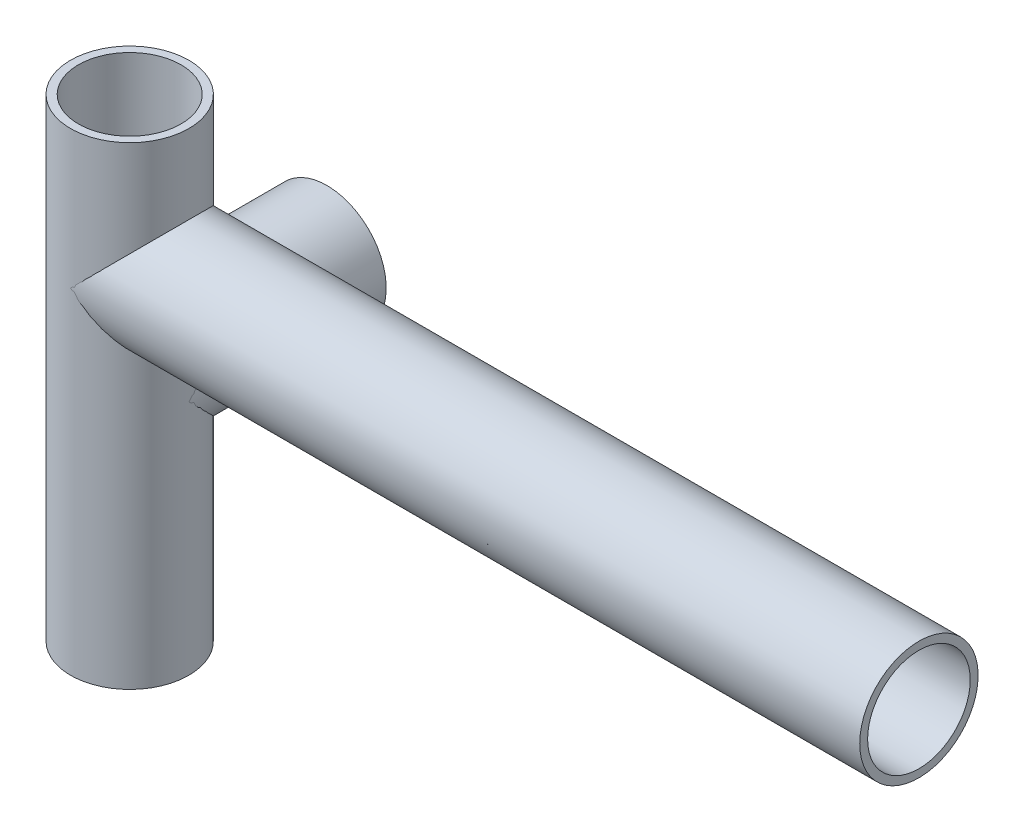
ISO-10303-21;
HEADER;
FILE_DESCRIPTION(('STEP AP214'),'2;1');
FILE_NAME('part.step','',(''),(''),'','','');
FILE_SCHEMA(('AUTOMOTIVE_DESIGN { 1 0 10303 214 1 1 1 1 }'));
ENDSEC;
DATA;
#1=APPLICATION_CONTEXT('core data for automotive mechanical design processes');
#2=APPLICATION_PROTOCOL_DEFINITION('international standard','automotive_design',2000,#1);
#3=PRODUCT_CONTEXT('',#1,'mechanical');
#4=PRODUCT('Part','Part','',(#3));
#5=PRODUCT_RELATED_PRODUCT_CATEGORY('part','',(#4));
#6=PRODUCT_DEFINITION_FORMATION('','',#4);
#7=PRODUCT_DEFINITION_CONTEXT('part definition',#1,'design');
#8=PRODUCT_DEFINITION('design','',#6,#7);
#9=PRODUCT_DEFINITION_SHAPE('','',#8);
#10=(LENGTH_UNIT() NAMED_UNIT(*) SI_UNIT(.MILLI.,.METRE.));
#11=(NAMED_UNIT(*) PLANE_ANGLE_UNIT() SI_UNIT($,.RADIAN.));
#12=(NAMED_UNIT(*) SI_UNIT($,.STERADIAN.) SOLID_ANGLE_UNIT());
#13=UNCERTAINTY_MEASURE_WITH_UNIT(LENGTH_MEASURE(1.E-05),#10,'distance_accuracy_value','');
#14=(GEOMETRIC_REPRESENTATION_CONTEXT(3) GLOBAL_UNCERTAINTY_ASSIGNED_CONTEXT((#13)) GLOBAL_UNIT_ASSIGNED_CONTEXT((#10,
#11,#12)) REPRESENTATION_CONTEXT('',''));
#15=CARTESIAN_POINT('',(0.,0.,0.));
#16=DIRECTION('',(0.,0.,1.));
#17=DIRECTION('',(1.,0.,0.));
#18=AXIS2_PLACEMENT_3D('',#15,#16,#17);
#19=CARTESIAN_POINT('',(200.,83.3215956619923,0.));
#20=DIRECTION('',(-1.,0.,0.));
#21=DIRECTION('',(0.,0.,1.));
#22=AXIS2_PLACEMENT_3D('',#19,#20,#21);
#23=PLANE('',#22);
#24=CARTESIAN_POINT('',(200.,83.3215956619923,0.));
#25=DIRECTION('',(-1.,0.,0.));
#26=DIRECTION('',(0.,0.,1.));
#27=AXIS2_PLACEMENT_3D('',#24,#25,#26);
#28=CIRCLE('',#27,13.);
#29=CARTESIAN_POINT('',(200.,83.3215956619923,13.));
#30=VERTEX_POINT('',#29);
#31=EDGE_CURVE('E85',#30,#30,#28,.T.);
#32=ORIENTED_EDGE('',*,*,#31,.T.);
#33=EDGE_LOOP('',(#32));
#34=FACE_BOUND('',#33,.T.);
#35=CARTESIAN_POINT('',(200.,83.3215956619923,0.));
#36=DIRECTION('',(-1.,0.,0.));
#37=DIRECTION('',(0.,0.,1.));
#38=AXIS2_PLACEMENT_3D('',#35,#36,#37);
#39=CIRCLE('',#38,15.);
#40=CARTESIAN_POINT('',(200.,83.3215956619923,15.));
#41=VERTEX_POINT('',#40);
#42=EDGE_CURVE('E75',#41,#41,#39,.T.);
#43=ORIENTED_EDGE('',*,*,#42,.F.);
#44=EDGE_LOOP('',(#43));
#45=FACE_BOUND('',#44,.T.);
#46=ADVANCED_FACE('F62',(#34,#45),#23,.F.);
#47=CARTESIAN_POINT('',(-33.1,83.3215956619923,0.));
#48=DIRECTION('',(1.,0.,0.));
#49=DIRECTION('',(0.,0.,-1.));
#50=AXIS2_PLACEMENT_3D('',#47,#48,#49);
#51=CYLINDRICAL_SURFACE('',#50,15.);
#52=CARTESIAN_POINT('',(0.,83.3215956619923,0.));
#53=DIRECTION('',(0.707106781186547,0.707106781186547,0.));
#54=DIRECTION('',(-0.707106781186548,0.707106781186548,0.));
#55=AXIS2_PLACEMENT_3D('',#52,#53,#54);
#56=ELLIPSE('',#55,21.2132034355964,15.);
#57=CARTESIAN_POINT('',(0.,83.3215956619923,15.));
#58=VERTEX_POINT('',#57);
#59=CARTESIAN_POINT('',(0.,83.3215956619923,-15.));
#60=VERTEX_POINT('',#59);
#61=EDGE_CURVE('E13',#58,#60,#56,.T.);
#62=ORIENTED_EDGE('',*,*,#61,.T.);
#63=CARTESIAN_POINT('',(0.,83.3215956619923,0.));
#64=DIRECTION('',(0.707106781186548,-0.707106781186547,0.));
#65=DIRECTION('',(0.707106781186548,0.707106781186547,0.));
#66=AXIS2_PLACEMENT_3D('',#63,#64,#65);
#67=ELLIPSE('',#66,21.2132034355964,15.);
#68=EDGE_CURVE('E82',#60,#58,#67,.T.);
#69=ORIENTED_EDGE('',*,*,#68,.T.);
#70=EDGE_LOOP('',(#62,#69));
#71=FACE_BOUND('',#70,.T.);
#72=ORIENTED_EDGE('',*,*,#42,.T.);
#73=EDGE_LOOP('',(#72));
#74=FACE_BOUND('',#73,.T.);
#75=ADVANCED_FACE('F87',(#71,#74),#51,.T.);
#76=CARTESIAN_POINT('',(-33.1,83.3215956619923,0.));
#77=DIRECTION('',(1.,0.,0.));
#78=DIRECTION('',(0.,0.,-1.));
#79=AXIS2_PLACEMENT_3D('',#76,#77,#78);
#80=CYLINDRICAL_SURFACE('',#79,13.);
#81=CARTESIAN_POINT('',(7.4833147735479,83.3215956619923,-13.));
#82=CARTESIAN_POINT('',(7.48330032461778,83.5352227300124,-13.000004815656));
#83=CARTESIAN_POINT('',(7.49250358836731,83.7488035739594,-12.9947225538469));
#84=CARTESIAN_POINT('',(7.52872787773291,84.1739950088454,-12.9737699948195));
#85=CARTESIAN_POINT('',(7.55575439498216,84.3856049721381,-12.9580964958846));
#86=CARTESIAN_POINT('',(7.62620831123749,84.8055251412111,-12.9167563207842));
#87=CARTESIAN_POINT('',(7.66967227052027,85.0138269047412,-12.8910673641999));
#88=CARTESIAN_POINT('',(7.77089445184944,85.4255599763329,-12.8303031148432));
#89=CARTESIAN_POINT('',(7.82865878578727,85.6289891610059,-12.7952238081709));
#90=CARTESIAN_POINT('',(7.98369462958644,86.1168765158415,-12.6992952400609));
#91=CARTESIAN_POINT('',(8.08725925657088,86.3984312820975,-12.633857284591));
#92=CARTESIAN_POINT('',(8.31263286079361,86.9497180249535,-12.4867226961187));
#93=CARTESIAN_POINT('',(8.43445214194291,87.219443212432,-12.4050168720378));
#94=CARTESIAN_POINT('',(8.69147425556954,87.7482514279094,-12.2263177494887));
#95=CARTESIAN_POINT('',(8.82671760132813,88.0072986829515,-12.1292776168405));
#96=CARTESIAN_POINT('',(9.10612772166769,88.5145029367969,-11.9209418963201));
#97=CARTESIAN_POINT('',(9.25029383212139,88.7626607437651,-11.8096473687542));
#98=CARTESIAN_POINT('',(9.62619184422612,89.3841636185792,-11.5074960662231));
#99=CARTESIAN_POINT('',(9.86200071545382,89.7503098660572,-11.3068337624087));
#100=CARTESIAN_POINT('',(10.3384211453355,90.4596438964124,-10.8729533620636));
#101=CARTESIAN_POINT('',(10.5790351280131,90.8028196910946,-10.6397184589893));
#102=CARTESIAN_POINT('',(11.0579429424891,91.4659538697362,-10.1410702661327));
#103=CARTESIAN_POINT('',(11.2962389659085,91.7859365110549,-9.8756913947145));
#104=CARTESIAN_POINT('',(11.7649308989509,92.4019849504382,-9.31238939758859));
#105=CARTESIAN_POINT('',(11.9953301899199,92.6980610607101,-9.01448043576875));
#106=CARTESIAN_POINT('',(12.3921069078173,93.1999655912031,-8.45722682732463));
#107=CARTESIAN_POINT('',(12.5611469445616,93.4110257902515,-8.20447452414563));
#108=CARTESIAN_POINT('',(12.8888712616614,93.8162231195473,-7.6793717765829));
#109=CARTESIAN_POINT('',(13.0475558477476,94.0103607494674,-7.40702191129013));
#110=CARTESIAN_POINT('',(13.3517861040361,94.379675300549,-6.84340772028994));
#111=CARTESIAN_POINT('',(13.4973493227332,94.5548776101372,-6.55216958033809));
#112=CARTESIAN_POINT('',(13.7729099048448,94.8845203794349,-5.95114844674506));
#113=CARTESIAN_POINT('',(13.9029103479139,95.0389649475545,-5.64136914039972));
#114=CARTESIAN_POINT('',(14.1223615565298,95.2984464960555,-5.06321216021355));
#115=CARTESIAN_POINT('',(14.2148703115982,95.4073437047135,-4.79772289400834));
#116=CARTESIAN_POINT('',(14.3862713582789,95.6084819623059,-4.25626491222228));
#117=CARTESIAN_POINT('',(14.465166398038,95.7007263730489,-3.98029832541167));
#118=CARTESIAN_POINT('',(14.6079470267452,95.8672703511128,-3.41930138133727));
#119=CARTESIAN_POINT('',(14.6718378596448,95.9415761881976,-3.13427423038992));
#120=CARTESIAN_POINT('',(14.7834147159342,96.0711225076522,-2.55677977645396));
#121=CARTESIAN_POINT('',(14.8311005592467,96.1263627781565,-2.2643123908248));
#122=CARTESIAN_POINT('',(14.9094691886021,96.2170520652866,-1.6725027250737));
#123=CARTESIAN_POINT('',(14.940063993095,96.2523986798669,-1.37313298435978));
#124=CARTESIAN_POINT('',(14.9831905730285,96.3022025600025,-0.771356738396842));
#125=CARTESIAN_POINT('',(14.9957223085218,96.3166597793599,-0.468950226433352));
#126=CARTESIAN_POINT('',(15.0024333815517,96.3244034730238,0.136301468362689));
#127=CARTESIAN_POINT('',(14.9966148926997,96.3176924547396,0.439146594993298));
#128=CARTESIAN_POINT('',(14.9667640071522,96.2832351938175,1.04271875137362));
#129=CARTESIAN_POINT('',(14.9427324990965,96.2554899774687,1.34344588374085));
#130=CARTESIAN_POINT('',(14.8796859932188,96.1825971166457,1.91599381703074));
#131=CARTESIAN_POINT('',(14.8420507474809,96.1390508710022,2.18817406972117));
#132=CARTESIAN_POINT('',(14.7525708800578,96.0353297961591,2.72694248265419));
#133=CARTESIAN_POINT('',(14.7007272029927,95.975156072403,2.99353101338361));
#134=CARTESIAN_POINT('',(14.5837219609498,95.8390297261653,3.51961240345519));
#135=CARTESIAN_POINT('',(14.5185616395594,95.7630785770626,3.77910592280797));
#136=CARTESIAN_POINT('',(14.3759237593629,95.5963277983445,4.28989113696732));
#137=CARTESIAN_POINT('',(14.2984415933814,95.5055226143948,4.54117972139521));
#138=CARTESIAN_POINT('',(14.1263382964299,95.3031011621957,5.05216355866893));
#139=CARTESIAN_POINT('',(14.030887264589,95.1904603799397,5.31117262919994));
#140=CARTESIAN_POINT('',(13.8285209231925,94.9505313639494,5.81777051253195));
#141=CARTESIAN_POINT('',(13.7216011133297,94.8232373789073,6.06535478738197));
#142=CARTESIAN_POINT('',(13.4977213562433,94.5552022541393,6.548466375614));
#143=CARTESIAN_POINT('',(13.380759185378,94.4144581354176,6.78399100014775));
#144=CARTESIAN_POINT('',(13.1381976049428,94.1206282468782,7.24258843909492));
#145=CARTESIAN_POINT('',(13.0125964257093,93.9675399472945,7.46565868522567));
#146=CARTESIAN_POINT('',(12.6880475261444,93.5688407717366,8.00991854428195));
#147=CARTESIAN_POINT('',(12.4844143832583,93.3159225872272,8.32300460032832));
#148=CARTESIAN_POINT('',(12.0650060435883,92.7868176351434,8.92013771134796));
#149=CARTESIAN_POINT('',(11.8492252561981,92.5106201243681,9.20417122350625));
#150=CARTESIAN_POINT('',(11.4095294437049,91.936213258928,9.74392446861584));
#151=CARTESIAN_POINT('',(11.1855961385243,91.6379526643915,9.99957460910132));
#152=CARTESIAN_POINT('',(10.7348826143817,91.0210867061631,10.4819441663041));
#153=CARTESIAN_POINT('',(10.508103220001,90.7024871306204,10.7086717593324));
#154=CARTESIAN_POINT('',(10.0965321747499,90.1023697931616,11.0961881808996));
#155=CARTESIAN_POINT('',(9.91132569789249,89.8240957428736,11.2615770839488));
#156=CARTESIAN_POINT('',(9.5464160984872,89.2530698383231,11.5725264500693));
#157=CARTESIAN_POINT('',(9.36671417979148,88.9603148531588,11.7180825993625));
#158=CARTESIAN_POINT('',(9.01820146123646,88.3601946498744,11.9883485411959));
#159=CARTESIAN_POINT('',(8.84936298780922,88.0528703252083,12.1131127040167));
#160=CARTESIAN_POINT('',(8.52873071082734,87.4219765879783,12.3409638364446));
#161=CARTESIAN_POINT('',(8.37692391718855,87.0984198322745,12.4440673797315));
#162=CARTESIAN_POINT('',(8.08106101986084,86.3906968735697,12.6385000362852));
#163=CARTESIAN_POINT('',(7.94050987759737,86.0040861285939,12.7266117602572));
#164=CARTESIAN_POINT('',(7.76673370277979,85.4091844129545,12.8328681533836));
#165=CARTESIAN_POINT('',(7.71500747906575,85.2085369313833,12.8639552636135));
#166=CARTESIAN_POINT('',(7.62595816296978,84.8029220232633,12.9169441237709));
#167=CARTESIAN_POINT('',(7.58862734564702,84.5979569760848,12.9388508007014));
#168=CARTESIAN_POINT('',(7.52981714021894,84.1823747520346,12.9731664304263));
#169=CARTESIAN_POINT('',(7.50853666567995,83.9717191273514,12.9854562684648));
#170=CARTESIAN_POINT('',(7.48379731692009,83.5490132206714,12.9997303145311));
#171=CARTESIAN_POINT('',(7.48033699880108,83.336963053063,13.0017153575167));
#172=CARTESIAN_POINT('',(7.49144683702095,82.9134035768395,12.9953169494776));
#173=CARTESIAN_POINT('',(7.50602519122618,82.7018945579417,12.9869287842393));
#174=CARTESIAN_POINT('',(7.55236685956024,82.2814259574719,12.9600330592671));
#175=CARTESIAN_POINT('',(7.58413294356896,82.0724667923719,12.9415238684794));
#176=CARTESIAN_POINT('',(7.66914999284259,81.6273276252515,12.8913506480412));
#177=CARTESIAN_POINT('',(7.72492347033709,81.3918095960806,12.8581206156968));
#178=CARTESIAN_POINT('',(7.85378448470306,80.9274782082325,12.7798172590921));
#179=CARTESIAN_POINT('',(7.92688589633178,80.6986703883667,12.7347344409408));
#180=CARTESIAN_POINT('',(8.08723702487729,80.2478435238612,12.6335108084614));
#181=CARTESIAN_POINT('',(8.17452856471537,80.0258469262021,12.5773371976278));
#182=CARTESIAN_POINT('',(8.36000843831314,79.5894774465135,12.4548238382399));
#183=CARTESIAN_POINT('',(8.45819438635636,79.3751029088881,12.3884863142273));
#184=CARTESIAN_POINT('',(8.73570541092119,78.8035944606104,12.1956044067365));
#185=CARTESIAN_POINT('',(8.92304115577597,78.4534519156588,12.0598137505977));
#186=CARTESIAN_POINT('',(9.31196247052873,77.7726689437787,11.7621224216651));
#187=CARTESIAN_POINT('',(9.51355782322464,77.4420421965976,11.6002037242214));
#188=CARTESIAN_POINT('',(9.92413958092173,76.7985655147786,11.2509651701536));
#189=CARTESIAN_POINT('',(10.1331359561042,76.4857411645743,11.0636100040856));
#190=CARTESIAN_POINT('',(10.5528265585281,75.8777777129622,10.664044145555));
#191=CARTESIAN_POINT('',(10.7635203561976,75.5826342871897,10.4518395685366));
#192=CARTESIAN_POINT('',(11.1956960775142,74.9917257657992,9.98815062097987));
#193=CARTESIAN_POINT('',(11.4170089768437,74.6971216585298,9.7350242005364));
#194=CARTESIAN_POINT('',(11.8521713755514,74.128809656284,9.20026681278124));
#195=CARTESIAN_POINT('',(12.0660194592669,73.8551057133505,8.91863047778808));
#196=CARTESIAN_POINT('',(12.4813907452545,73.3310727872634,8.3273734879751));
#197=CARTESIAN_POINT('',(12.6829400970225,73.0806935680181,8.01781594094474));
#198=CARTESIAN_POINT('',(13.0697891290302,72.6053256516538,7.37039180078412));
#199=CARTESIAN_POINT('',(13.2550956915549,72.3803261890889,7.03253731726714));
#200=CARTESIAN_POINT('',(13.5556266105811,72.0184063368408,6.4284201238546));
#201=CARTESIAN_POINT('',(13.6758870931085,71.8745300629894,6.16880404808345));
#202=CARTESIAN_POINT('',(13.90394065321,71.6030207882139,5.63598741585722));
#203=CARTESIAN_POINT('',(14.0117369169115,71.4753836353741,5.36279035664521));
#204=CARTESIAN_POINT('',(14.2130856242642,71.2378973779852,4.80379178993229));
#205=CARTESIAN_POINT('',(14.3066428385967,71.1280423148995,4.51799454559628));
#206=CARTESIAN_POINT('',(14.4778360871033,70.9276272343289,3.93503881382266));
#207=CARTESIAN_POINT('',(14.5554717950055,70.8370676122549,3.63788009370765));
#208=CARTESIAN_POINT('',(14.6937710913513,70.676097656186,3.03158738055603));
#209=CARTESIAN_POINT('',(14.7542939397482,70.6058543056779,2.72237660571188));
#210=CARTESIAN_POINT('',(14.8561405740246,70.4878197607463,2.09656185683562));
#211=CARTESIAN_POINT('',(14.8974643397773,70.4400285898599,1.7799578750534));
#212=CARTESIAN_POINT('',(14.9598721401341,70.3679050099559,1.1422772902571));
#213=CARTESIAN_POINT('',(14.9809673015676,70.3435597044092,0.821203244742571));
#214=CARTESIAN_POINT('',(15.0024060205379,70.318818010832,0.177457976470482));
#215=CARTESIAN_POINT('',(15.0027518947885,70.3184189491389,-0.145213063954967));
#216=CARTESIAN_POINT('',(14.9839144758321,70.3401584240185,-0.749968070564547));
#217=CARTESIAN_POINT('',(14.9670934702113,70.3595707657523,-1.03223049483927));
#218=CARTESIAN_POINT('',(14.9177772962452,70.4165468789855,-1.59350735869836));
#219=CARTESIAN_POINT('',(14.8852836452823,70.4541088932843,-1.87252211003578));
#220=CARTESIAN_POINT('',(14.805247648861,70.5467804957945,-2.42542524818795));
#221=CARTESIAN_POINT('',(14.7577045795746,70.6018909280284,-2.69931338775813));
#222=CARTESIAN_POINT('',(14.6484354971255,70.7288316461401,-3.24029314724925));
#223=CARTESIAN_POINT('',(14.5867088005768,70.8006627376436,-3.5073844390001));
#224=CARTESIAN_POINT('',(14.4494275319202,70.9608643878076,-4.03600965988471));
#225=CARTESIAN_POINT('',(14.3737399964556,71.0493941861418,-4.29746056283275));
#226=CARTESIAN_POINT('',(14.210118508006,71.2414467994678,-4.81094396364023));
#227=CARTESIAN_POINT('',(14.1221798583932,71.3449753650474,-5.06297280220392));
#228=CARTESIAN_POINT('',(13.9353256523878,71.5658832560723,-5.5566498141109));
#229=CARTESIAN_POINT('',(13.8364102429352,71.6832623961089,-5.79829812635254));
#230=CARTESIAN_POINT('',(13.6288523983221,71.930802762267,-6.27064333757991));
#231=CARTESIAN_POINT('',(13.5202079637405,72.0609666163219,-6.50133797048951));
#232=CARTESIAN_POINT('',(13.2416217566069,72.3967156180598,-7.05662267833362));
#233=CARTESIAN_POINT('',(13.0667745602973,72.6091050178402,-7.3746704911644));
#234=CARTESIAN_POINT('',(12.7025984861055,73.0564652013179,-7.98564893485582));
#235=CARTESIAN_POINT('',(12.5132638127015,73.2914450317555,-8.27856941342216));
#236=CARTESIAN_POINT('',(12.1233361623318,73.7823298831013,-8.83978162519758));
#237=CARTESIAN_POINT('',(11.9227163364092,74.0382855310617,-9.10801024280585));
#238=CARTESIAN_POINT('',(11.5143349809561,74.5689590632172,-9.61909913261418));
#239=CARTESIAN_POINT('',(11.3065744827913,74.8436742434813,-9.86196304807957));
#240=CARTESIAN_POINT('',(10.8834478494597,75.4166873975873,-10.3272159105889));
#241=CARTESIAN_POINT('',(10.6680128158481,75.7153490193422,-10.549093690495));
#242=CARTESIAN_POINT('',(10.2380521548219,76.3311456718634,-10.9668642813446));
#243=CARTESIAN_POINT('',(10.023526841012,76.6482865928587,-11.1627487410569));
#244=CARTESIAN_POINT('',(9.60133472374677,77.3010010242886,-11.5278838828167));
#245=CARTESIAN_POINT('',(9.39365712135371,77.6365430469969,-11.6971782581102));
#246=CARTESIAN_POINT('',(8.99213909754803,78.327813960824,-12.0085699416922));
#247=CARTESIAN_POINT('',(8.79828804316989,78.6835269536624,-12.1506882935595));
#248=CARTESIAN_POINT('',(8.51703908794627,79.2509518423524,-12.3480740873508));
#249=CARTESIAN_POINT('',(8.42117690126761,79.4549548303107,-12.4135337395197));
#250=CARTESIAN_POINT('',(8.2389392318482,79.8698029496247,-12.5352243550162));
#251=CARTESIAN_POINT('',(8.15256039460472,80.0806456271974,-12.5914585851127));
#252=CARTESIAN_POINT('',(7.99206955799774,80.5086975967145,-12.6939309444038));
#253=CARTESIAN_POINT('',(7.91792526382577,80.7258882863112,-12.7401954921791));
#254=CARTESIAN_POINT('',(7.78456732675144,81.1666953328284,-12.8221151710825));
#255=CARTESIAN_POINT('',(7.72534670711913,81.390308632547,-12.8577752611414));
#256=CARTESIAN_POINT('',(7.6132797772605,81.8949158432711,-12.9245198974199));
#257=CARTESIAN_POINT('',(7.56498210899386,82.1773457760189,-12.9526969943518));
#258=CARTESIAN_POINT('',(7.50001576295461,82.7470782338658,-12.9904300153001));
#259=CARTESIAN_POINT('',(7.48333419981948,83.0343787257462,-12.9999935254555));
#260=CARTESIAN_POINT('',(7.4833147735479,83.3215956619923,-13.));
#261=B_SPLINE_CURVE_WITH_KNOTS('',3,(#81,#82,#83,#84,#85,#86,#87,#88,#89,#90,#91,#92,#93,#94,
#95,#96,#97,#98,#99,#100,#101,#102,#103,#104,#105,#106,#107,#108,#109,#110,#111,#112,#113,#114,
#115,#116,#117,#118,#119,#120,#121,#122,#123,#124,#125,#126,#127,#128,#129,#130,#131,#132,#133,
#134,#135,#136,#137,#138,#139,#140,#141,#142,#143,#144,#145,#146,#147,#148,#149,#150,#151,#152,
#153,#154,#155,#156,#157,#158,#159,#160,#161,#162,#163,#164,#165,#166,#167,#168,#169,#170,#171,
#172,#173,#174,#175,#176,#177,#178,#179,#180,#181,#182,#183,#184,#185,#186,#187,#188,#189,#190,
#191,#192,#193,#194,#195,#196,#197,#198,#199,#200,#201,#202,#203,#204,#205,#206,#207,#208,#209,
#210,#211,#212,#213,#214,#215,#216,#217,#218,#219,#220,#221,#222,#223,#224,#225,#226,#227,#228,
#229,#230,#231,#232,#233,#234,#235,#236,#237,#238,#239,#240,#241,#242,#243,#244,#245,#246,#247,
#248,#249,#250,#251,#252,#253,#254,#255,#256,#257,#258,#259,#260),.UNSPECIFIED.,.T.,.F.,(4,2,2,
2,2,2,2,2,2,2,2,2,2,2,2,2,2,2,2,2,2,2,2,2,2,2,2,2,2,2,2,2,2,2,2,2,2,2,2,2,2,2,2,2,2,2,2,2,2,2,2,
2,2,2,2,2,2,2,2,2,2,2,2,2,2,2,2,2,2,2,2,2,2,2,2,2,2,2,2,2,2,2,2,2,2,2,2,2,2,4),(0.,
0.640546705036322,1.28129086515996,1.92346863561455,2.56592134413675,3.48552763805613,
4.40565497633938,5.32864891642606,6.25157423988832,7.68818683192558,9.12554343320674,
10.561374359565,11.9965825867194,13.1060654709905,14.2155155844562,15.3234591967294,
16.4311831988409,17.3348052292767,18.2382446351603,19.1413678186236,20.0445010376869,
20.9522415606526,21.8599840911238,22.7676191021745,23.6752098312403,24.5088811684452,
25.3424970940651,26.1760352072218,27.0098857187966,27.9034355052866,28.7973372091006,
29.6914373591568,30.5857212104145,31.9369443541856,33.2887945259531,34.6438892913097,
35.9986001227708,37.1166755169643,38.2349937143487,39.3503400340676,40.4648298101621,
41.7225869469662,42.350556798092,42.9781891941292,43.6134775750253,44.2487144801581,
44.8842401815141,45.5198683312102,46.2516150482253,46.9839496777857,47.7184832299104,
48.4528562461832,49.7099227286448,50.9678601458539,52.2275619621478,53.4869544145806,
54.8266718677139,56.1666420258718,57.5036560349665,58.8401007670364,59.8000281549952,
60.7597096194714,61.7190688390444,62.6784477163546,63.6455013300257,64.6125559574783,
65.5790783467956,66.5454928210803,67.3947563319661,68.2439376360004,69.0931597890979,
69.9424228674256,70.8002364080107,71.6583797124503,72.5165115307832,73.3748201111018,
74.634519175112,75.8947248262773,77.1580671281404,78.4212277192301,79.7098405082843,
80.9988663104279,82.2857512902051,83.5716357074143,84.2754049594113,84.9789244627005,
85.6805561442444,86.3818592060568,87.2434114953193,88.1046125774115),.UNSPECIFIED.);
#262=CARTESIAN_POINT('',(7.4833147735479,83.3215956619923,-13.));
#263=VERTEX_POINT('',#262);
#264=EDGE_CURVE('E65',#263,#263,#261,.T.);
#265=ORIENTED_EDGE('',*,*,#264,.F.);
#266=EDGE_LOOP('',(#265));
#267=FACE_BOUND('',#266,.T.);
#268=ORIENTED_EDGE('',*,*,#31,.F.);
#269=EDGE_LOOP('',(#268));
#270=FACE_BOUND('',#269,.T.);
#271=ADVANCED_FACE('F90',(#267,#270),#80,.F.);
#272=CARTESIAN_POINT('',(0.,-1.67840433800769,0.));
#273=DIRECTION('',(0.,1.,0.));
#274=DIRECTION('',(0.,0.,1.));
#275=AXIS2_PLACEMENT_3D('',#272,#273,#274);
#276=CYLINDRICAL_SURFACE('',#275,15.);
#277=ORIENTED_EDGE('',*,*,#264,.T.);
#278=EDGE_LOOP('',(#277));
#279=FACE_BOUND('',#278,.T.);
#280=ORIENTED_EDGE('',*,*,#68,.F.);
#281=ORIENTED_EDGE('',*,*,#61,.F.);
#282=EDGE_LOOP('',(#280,#281));
#283=FACE_BOUND('',#282,.T.);
#284=ADVANCED_FACE('F83',(#279,#283),#276,.F.);
#285=CLOSED_SHELL('',(#46,#75,#271,#284));
#286=MANIFOLD_SOLID_BREP('B2',#285);
#287=CARTESIAN_POINT('',(0.,58.3215956619923,-50.));
#288=DIRECTION('',(0.,0.,-1.));
#289=DIRECTION('',(-1.,0.,0.));
#290=AXIS2_PLACEMENT_3D('',#287,#288,#289);
#291=PLANE('',#290);
#292=CARTESIAN_POINT('',(0.,58.3215956619923,-50.));
#293=DIRECTION('',(0.,0.,-1.));
#294=DIRECTION('',(-1.,0.,0.));
#295=AXIS2_PLACEMENT_3D('',#292,#293,#294);
#296=CIRCLE('',#295,13.);
#297=CARTESIAN_POINT('',(-13.,58.3215956619923,-50.));
#298=VERTEX_POINT('',#297);
#299=EDGE_CURVE('E155',#298,#298,#296,.T.);
#300=ORIENTED_EDGE('',*,*,#299,.F.);
#301=EDGE_LOOP('',(#300));
#302=FACE_BOUND('',#301,.T.);
#303=CARTESIAN_POINT('',(0.,58.3215956619923,-50.));
#304=DIRECTION('',(0.,0.,-1.));
#305=DIRECTION('',(-1.,0.,0.));
#306=AXIS2_PLACEMENT_3D('',#303,#304,#305);
#307=CIRCLE('',#306,15.);
#308=CARTESIAN_POINT('',(-15.,58.3215956619923,-50.));
#309=VERTEX_POINT('',#308);
#310=EDGE_CURVE('E60',#309,#309,#307,.T.);
#311=ORIENTED_EDGE('',*,*,#310,.T.);
#312=EDGE_LOOP('',(#311));
#313=FACE_BOUND('',#312,.T.);
#314=ADVANCED_FACE('F142',(#302,#313),#291,.T.);
#315=CARTESIAN_POINT('',(0.,58.3215956619923,0.));
#316=DIRECTION('',(0.,0.,-1.));
#317=DIRECTION('',(-1.,0.,0.));
#318=AXIS2_PLACEMENT_3D('',#315,#316,#317);
#319=CYLINDRICAL_SURFACE('',#318,15.);
#320=CARTESIAN_POINT('',(0.,58.3215956619923,0.));
#321=DIRECTION('',(0.,0.707106781186548,-0.707106781186547));
#322=DIRECTION('',(0.,-0.707106781186547,-0.707106781186547));
#323=AXIS2_PLACEMENT_3D('',#320,#321,#322);
#324=ELLIPSE('',#323,21.2132034355964,15.);
#325=CARTESIAN_POINT('',(-15.,58.3215956619923,0.));
#326=VERTEX_POINT('',#325);
#327=CARTESIAN_POINT('',(15.,58.3215956619923,0.));
#328=VERTEX_POINT('',#327);
#329=EDGE_CURVE('E161',#326,#328,#324,.F.);
#330=ORIENTED_EDGE('',*,*,#329,.F.);
#331=CARTESIAN_POINT('',(0.,58.3215956619923,0.));
#332=DIRECTION('',(0.,-0.707106781186547,-0.707106781186547));
#333=DIRECTION('',(0.,0.707106781186548,-0.707106781186547));
#334=AXIS2_PLACEMENT_3D('',#331,#332,#333);
#335=ELLIPSE('',#334,21.2132034355964,15.);
#336=EDGE_CURVE('E163',#328,#326,#335,.F.);
#337=ORIENTED_EDGE('',*,*,#336,.F.);
#338=EDGE_LOOP('',(#330,#337));
#339=FACE_BOUND('',#338,.T.);
#340=ORIENTED_EDGE('',*,*,#310,.F.);
#341=EDGE_LOOP('',(#340));
#342=FACE_BOUND('',#341,.T.);
#343=ADVANCED_FACE('F168',(#339,#342),#319,.T.);
#344=CARTESIAN_POINT('',(0.,58.3215956619923,0.));
#345=DIRECTION('',(0.,0.,-1.));
#346=DIRECTION('',(-1.,0.,0.));
#347=AXIS2_PLACEMENT_3D('',#344,#345,#346);
#348=CYLINDRICAL_SURFACE('',#347,13.);
#349=CARTESIAN_POINT('',(-13.,58.3215956619923,-7.48331477354789));
#350=CARTESIAN_POINT('',(-13.000004815656,58.1079685939723,-7.48330032461777));
#351=CARTESIAN_POINT('',(-12.9947225538469,57.8943877500252,-7.49250358836731));
#352=CARTESIAN_POINT('',(-12.9737699948195,57.4691963151393,-7.52872787773291));
#353=CARTESIAN_POINT('',(-12.9580964958846,57.2575863518465,-7.55575439498216));
#354=CARTESIAN_POINT('',(-12.9167563207842,56.8376661827735,-7.62620831123749));
#355=CARTESIAN_POINT('',(-12.8910673641999,56.6293644192434,-7.66967227052027));
#356=CARTESIAN_POINT('',(-12.8303031148432,56.2176313476518,-7.77089445184944));
#357=CARTESIAN_POINT('',(-12.7952238081709,56.0142021629787,-7.82865878578728));
#358=CARTESIAN_POINT('',(-12.6992952400609,55.5263148081431,-7.98369462958646));
#359=CARTESIAN_POINT('',(-12.633857284591,55.2447600418871,-8.08725925657089));
#360=CARTESIAN_POINT('',(-12.4867226961187,54.6934732990311,-8.31263286079362));
#361=CARTESIAN_POINT('',(-12.4050168720378,54.4237481115526,-8.43445214194292));
#362=CARTESIAN_POINT('',(-12.2263177494887,53.8949398960752,-8.69147425556955));
#363=CARTESIAN_POINT('',(-12.1292776168405,53.6358926410332,-8.82671760132814));
#364=CARTESIAN_POINT('',(-11.9209418963201,53.1286883871877,-9.10612772166771));
#365=CARTESIAN_POINT('',(-11.8096473687541,52.8805305802196,-9.25029383212141));
#366=CARTESIAN_POINT('',(-11.5074960662231,52.2590277054055,-9.62619184422613));
#367=CARTESIAN_POINT('',(-11.3068337624086,51.8928814579274,-9.86200071545384));
#368=CARTESIAN_POINT('',(-10.8729533620636,51.1835474275722,-10.3384211453355));
#369=CARTESIAN_POINT('',(-10.6397184589893,50.84037163289,-10.5790351280131));
#370=CARTESIAN_POINT('',(-10.1410702661326,50.1772374542484,-11.0579429424891));
#371=CARTESIAN_POINT('',(-9.87569139471448,49.8572548129298,-11.2962389659085));
#372=CARTESIAN_POINT('',(-9.31238939758857,49.2412063735465,-11.7649308989509));
#373=CARTESIAN_POINT('',(-9.01448043576872,48.9451302632745,-11.99533018992));
#374=CARTESIAN_POINT('',(-8.4572268273246,48.4432257327815,-12.3921069078173));
#375=CARTESIAN_POINT('',(-8.20447452414561,48.2321655337331,-12.5611469445616));
#376=CARTESIAN_POINT('',(-7.67937177658288,47.8269682044373,-12.8888712616615));
#377=CARTESIAN_POINT('',(-7.40702191129011,47.6328305745173,-13.0475558477476));
#378=CARTESIAN_POINT('',(-6.84340772028993,47.2635160234357,-13.3517861040361));
#379=CARTESIAN_POINT('',(-6.55216958033807,47.0883137138475,-13.4973493227332));
#380=CARTESIAN_POINT('',(-5.95114844674505,46.7586709445497,-13.7729099048448));
#381=CARTESIAN_POINT('',(-5.64136914039971,46.6042263764301,-13.9029103479139));
#382=CARTESIAN_POINT('',(-5.06321216021354,46.3447448279291,-14.1223615565298));
#383=CARTESIAN_POINT('',(-4.79772289400832,46.2358476192711,-14.2148703115982));
#384=CARTESIAN_POINT('',(-4.25626491222227,46.0347093616788,-14.3862713582789));
#385=CARTESIAN_POINT('',(-3.98029832541166,45.9424649509357,-14.4651663980381));
#386=CARTESIAN_POINT('',(-3.41930138133726,45.7759209728718,-14.6079470267453));
#387=CARTESIAN_POINT('',(-3.1342742303899,45.701615135787,-14.6718378596448));
#388=CARTESIAN_POINT('',(-2.55677977645395,45.5720688163325,-14.7834147159342));
#389=CARTESIAN_POINT('',(-2.26431239082479,45.5168285458281,-14.8311005592467));
#390=CARTESIAN_POINT('',(-1.67250272507369,45.426139258698,-14.9094691886021));
#391=CARTESIAN_POINT('',(-1.37313298435977,45.3907926441177,-14.940063993095));
#392=CARTESIAN_POINT('',(-0.771356738396835,45.3409887639821,-14.9831905730285));
#393=CARTESIAN_POINT('',(-0.468950226433345,45.3265315446247,-14.9957223085219));
#394=CARTESIAN_POINT('',(0.136301468362696,45.3187878509609,-15.0024333815517));
#395=CARTESIAN_POINT('',(0.439146594993305,45.325498869245,-14.9966148926997));
#396=CARTESIAN_POINT('',(1.04271875137362,45.3599561301672,-14.9667640071522));
#397=CARTESIAN_POINT('',(1.34344588374085,45.3877013465159,-14.9427324990965));
#398=CARTESIAN_POINT('',(1.91599381703074,45.4605942073389,-14.8796859932189));
#399=CARTESIAN_POINT('',(2.18817406972117,45.5041404529824,-14.8420507474809));
#400=CARTESIAN_POINT('',(2.72694248265419,45.6078615278255,-14.7525708800578));
#401=CARTESIAN_POINT('',(2.99353101338361,45.6680352515817,-14.7007272029927));
#402=CARTESIAN_POINT('',(3.51961240345519,45.8041615978193,-14.5837219609498));
#403=CARTESIAN_POINT('',(3.77910592280796,45.880112746922,-14.5185616395594));
#404=CARTESIAN_POINT('',(4.28989113696732,46.0468635256402,-14.3759237593629));
#405=CARTESIAN_POINT('',(4.54117972139521,46.1376687095899,-14.2984415933814));
#406=CARTESIAN_POINT('',(5.05216355866893,46.340090161789,-14.1263382964299));
#407=CARTESIAN_POINT('',(5.31117262919993,46.452730944045,-14.0308872645891));
#408=CARTESIAN_POINT('',(5.81777051253194,46.6926599600352,-13.8285209231925));
#409=CARTESIAN_POINT('',(6.06535478738196,46.8199539450773,-13.7216011133297));
#410=CARTESIAN_POINT('',(6.54846637561399,47.0879890698454,-13.4977213562433));
#411=CARTESIAN_POINT('',(6.78399100014775,47.228733188567,-13.380759185378));
#412=CARTESIAN_POINT('',(7.24258843909492,47.5225630771065,-13.1381976049428));
#413=CARTESIAN_POINT('',(7.46565868522566,47.6756513766901,-13.0125964257093));
#414=CARTESIAN_POINT('',(8.00991854428195,48.074350552248,-12.6880475261444));
#415=CARTESIAN_POINT('',(8.32300460032833,48.3272687367575,-12.4844143832583));
#416=CARTESIAN_POINT('',(8.92013771134796,48.8563736888413,-12.0650060435883));
#417=CARTESIAN_POINT('',(9.20417122350625,49.1325711996165,-11.8492252561982));
#418=CARTESIAN_POINT('',(9.74392446861584,49.7069780650567,-11.4095294437049));
#419=CARTESIAN_POINT('',(9.99957460910132,50.0052386595931,-11.1855961385243));
#420=CARTESIAN_POINT('',(10.4819441663041,50.6221046178216,-10.7348826143817));
#421=CARTESIAN_POINT('',(10.7086717593324,50.9407041933642,-10.508103220001));
#422=CARTESIAN_POINT('',(11.0961881808996,51.540821530823,-10.0965321747499));
#423=CARTESIAN_POINT('',(11.2615770839488,51.819095581111,-9.91132569789249));
#424=CARTESIAN_POINT('',(11.5725264500693,52.3901214856615,-9.5464160984872));
#425=CARTESIAN_POINT('',(11.7180825993625,52.6828764708259,-9.36671417979148));
#426=CARTESIAN_POINT('',(11.9883485411959,53.2829966741103,-9.01820146123646));
#427=CARTESIAN_POINT('',(12.1131127040167,53.5903209987764,-8.84936298780923));
#428=CARTESIAN_POINT('',(12.3409638364446,54.2212147360063,-8.52873071082735));
#429=CARTESIAN_POINT('',(12.4440673797315,54.5447714917102,-8.37692391718856));
#430=CARTESIAN_POINT('',(12.6385000362852,55.2524944504149,-8.08106101986084));
#431=CARTESIAN_POINT('',(12.7266117602572,55.6391051953907,-7.94050987759738));
#432=CARTESIAN_POINT('',(12.8328681533836,56.2340069110301,-7.7667337027798));
#433=CARTESIAN_POINT('',(12.8639552636135,56.4346543926013,-7.71500747906576));
#434=CARTESIAN_POINT('',(12.9169441237709,56.8402693007213,-7.62595816296979));
#435=CARTESIAN_POINT('',(12.9388508007014,57.0452343478999,-7.58862734564704));
#436=CARTESIAN_POINT('',(12.9731664304263,57.4608165719501,-7.52981714021896));
#437=CARTESIAN_POINT('',(12.9854562684648,57.6714721966332,-7.50853666567996));
#438=CARTESIAN_POINT('',(12.9997303145311,58.0941781033133,-7.4837973169201));
#439=CARTESIAN_POINT('',(13.0017153575167,58.3062282709217,-7.48033699880109));
#440=CARTESIAN_POINT('',(12.9953169494776,58.7297877471452,-7.49144683702096));
#441=CARTESIAN_POINT('',(12.9869287842393,58.941296766043,-7.50602519122619));
#442=CARTESIAN_POINT('',(12.9600330592671,59.3617653665128,-7.55236685956026));
#443=CARTESIAN_POINT('',(12.9415238684794,59.5707245316128,-7.58413294356899));
#444=CARTESIAN_POINT('',(12.8913506480412,60.0158636987332,-7.66914999284261));
#445=CARTESIAN_POINT('',(12.8581206156968,60.2513817279041,-7.7249234703371));
#446=CARTESIAN_POINT('',(12.7798172590921,60.7157131157521,-7.85378448470307));
#447=CARTESIAN_POINT('',(12.7347344409408,60.9445209356179,-7.9268858963318));
#448=CARTESIAN_POINT('',(12.6335108084614,61.3953478001235,-8.08723702487731));
#449=CARTESIAN_POINT('',(12.5773371976278,61.6173443977826,-8.17452856471539));
#450=CARTESIAN_POINT('',(12.4548238382399,62.0537138774711,-8.36000843831316));
#451=CARTESIAN_POINT('',(12.3884863142273,62.2680884150965,-8.45819438635638));
#452=CARTESIAN_POINT('',(12.1956044067365,62.8395968633743,-8.7357054109212));
#453=CARTESIAN_POINT('',(12.0598137505977,63.1897394083258,-8.92304115577598));
#454=CARTESIAN_POINT('',(11.7621224216651,63.8705223802059,-9.31196247052874));
#455=CARTESIAN_POINT('',(11.6002037242214,64.201149127387,-9.51355782322465));
#456=CARTESIAN_POINT('',(11.2509651701536,64.8446258092061,-9.92413958092175));
#457=CARTESIAN_POINT('',(11.0636100040856,65.1574501594103,-10.1331359561042));
#458=CARTESIAN_POINT('',(10.664044145555,65.7654136110224,-10.5528265585281));
#459=CARTESIAN_POINT('',(10.4518395685366,66.060557036795,-10.7635203561976));
#460=CARTESIAN_POINT('',(9.98815062097986,66.6514655581854,-11.1956960775142));
#461=CARTESIAN_POINT('',(9.7350242005364,66.9460696654549,-11.4170089768438));
#462=CARTESIAN_POINT('',(9.20026681278123,67.5143816677006,-11.8521713755514));
#463=CARTESIAN_POINT('',(8.91863047778808,67.7880856106342,-12.0660194592669));
#464=CARTESIAN_POINT('',(8.3273734879751,68.3121185367212,-12.4813907452545));
#465=CARTESIAN_POINT('',(8.01781594094474,68.5624977559665,-12.6829400970225));
#466=CARTESIAN_POINT('',(7.37039180078412,69.0378656723309,-13.0697891290302));
#467=CARTESIAN_POINT('',(7.03253731726715,69.2628651348957,-13.2550956915549));
#468=CARTESIAN_POINT('',(6.42842012385461,69.6247849871438,-13.5556266105811));
#469=CARTESIAN_POINT('',(6.16880404808346,69.7686612609953,-13.6758870931085));
#470=CARTESIAN_POINT('',(5.63598741585723,70.0401705357708,-13.9039406532101));
#471=CARTESIAN_POINT('',(5.36279035664523,70.1678076886105,-14.0117369169115));
#472=CARTESIAN_POINT('',(4.8037917899323,70.4052939459994,-14.2130856242642));
#473=CARTESIAN_POINT('',(4.51799454559629,70.5151490090851,-14.3066428385967));
#474=CARTESIAN_POINT('',(3.93503881382267,70.7155640896558,-14.4778360871033));
#475=CARTESIAN_POINT('',(3.63788009370766,70.8061237117297,-14.5554717950055));
#476=CARTESIAN_POINT('',(3.03158738055604,70.9670936677987,-14.6937710913513));
#477=CARTESIAN_POINT('',(2.72237660571189,71.0373370183068,-14.7542939397482));
#478=CARTESIAN_POINT('',(2.09656185683563,71.1553715632384,-14.8561405740246));
#479=CARTESIAN_POINT('',(1.77995787505341,71.2031627341248,-14.8974643397773));
#480=CARTESIAN_POINT('',(1.14227729025711,71.2752863140287,-14.9598721401341));
#481=CARTESIAN_POINT('',(0.821203244742578,71.2996316195755,-14.9809673015676));
#482=CARTESIAN_POINT('',(0.177457976470488,71.3243733131526,-15.0024060205379));
#483=CARTESIAN_POINT('',(-0.145213063954962,71.3247723748457,-15.0027518947885));
#484=CARTESIAN_POINT('',(-0.749968070564546,71.3030328999661,-14.9839144758321));
#485=CARTESIAN_POINT('',(-1.03223049483927,71.2836205582324,-14.9670934702113));
#486=CARTESIAN_POINT('',(-1.59350735869836,71.2266444449992,-14.9177772962452));
#487=CARTESIAN_POINT('',(-1.87252211003578,71.1890824307004,-14.8852836452823));
#488=CARTESIAN_POINT('',(-2.42542524818795,71.0964108281902,-14.805247648861));
#489=CARTESIAN_POINT('',(-2.69931338775813,71.0413003959563,-14.7577045795746));
#490=CARTESIAN_POINT('',(-3.24029314724925,70.9143596778445,-14.6484354971255));
#491=CARTESIAN_POINT('',(-3.5073844390001,70.842528586341,-14.5867088005768));
#492=CARTESIAN_POINT('',(-4.03600965988471,70.682326936177,-14.4494275319202));
#493=CARTESIAN_POINT('',(-4.29746056283275,70.5937971378428,-14.3737399964556));
#494=CARTESIAN_POINT('',(-4.81094396364023,70.4017445245168,-14.210118508006));
#495=CARTESIAN_POINT('',(-5.06297280220392,70.2982159589372,-14.1221798583932));
#496=CARTESIAN_POINT('',(-5.5566498141109,70.0773080679123,-13.9353256523878));
#497=CARTESIAN_POINT('',(-5.79829812635255,69.9599289278758,-13.8364102429352));
#498=CARTESIAN_POINT('',(-6.27064333757992,69.7123885617176,-13.6288523983221));
#499=CARTESIAN_POINT('',(-6.50133797048952,69.5822247076627,-13.5202079637405));
#500=CARTESIAN_POINT('',(-7.05662267833363,69.2464757059249,-13.2416217566069));
#501=CARTESIAN_POINT('',(-7.3746704911644,69.0340863061445,-13.0667745602973));
#502=CARTESIAN_POINT('',(-7.98564893485582,68.5867261226668,-12.7025984861055));
#503=CARTESIAN_POINT('',(-8.27856941342216,68.3517462922292,-12.5132638127015));
#504=CARTESIAN_POINT('',(-8.83978162519759,67.8608614408834,-12.1233361623318));
#505=CARTESIAN_POINT('',(-9.10801024280586,67.6049057929229,-11.9227163364092));
#506=CARTESIAN_POINT('',(-9.61909913261419,67.0742322607675,-11.5143349809561));
#507=CARTESIAN_POINT('',(-9.86196304807958,66.7995170805033,-11.3065744827913));
#508=CARTESIAN_POINT('',(-10.3272159105889,66.2265039263974,-10.8834478494597));
#509=CARTESIAN_POINT('',(-10.549093690495,65.9278423046425,-10.6680128158481));
#510=CARTESIAN_POINT('',(-10.9668642813446,65.3120456521213,-10.2380521548219));
#511=CARTESIAN_POINT('',(-11.1627487410569,64.9949047311259,-10.023526841012));
#512=CARTESIAN_POINT('',(-11.5278838828168,64.342190299696,-9.60133472374676));
#513=CARTESIAN_POINT('',(-11.6971782581102,64.0066482769877,-9.3936571213537));
#514=CARTESIAN_POINT('',(-12.0085699416922,63.3153773631607,-8.99213909754802));
#515=CARTESIAN_POINT('',(-12.1506882935595,62.9596643703222,-8.79828804316988));
#516=CARTESIAN_POINT('',(-12.3480740873508,62.3922394816322,-8.51703908794626));
#517=CARTESIAN_POINT('',(-12.4135337395197,62.1882364936739,-8.4211769012676));
#518=CARTESIAN_POINT('',(-12.5352243550162,61.7733883743599,-8.23893923184818));
#519=CARTESIAN_POINT('',(-12.5914585851127,61.5625456967872,-8.15256039460471));
#520=CARTESIAN_POINT('',(-12.6939309444038,61.1344937272701,-7.99206955799773));
#521=CARTESIAN_POINT('',(-12.7401954921791,60.9173030376734,-7.91792526382577));
#522=CARTESIAN_POINT('',(-12.8221151710825,60.4764959911562,-7.78456732675144));
#523=CARTESIAN_POINT('',(-12.8577752611414,60.2528826914376,-7.72534670711913));
#524=CARTESIAN_POINT('',(-12.9245198974199,59.7482754807135,-7.6132797772605));
#525=CARTESIAN_POINT('',(-12.9526969943518,59.4658455479657,-7.56498210899386));
#526=CARTESIAN_POINT('',(-12.9904300153001,58.8961130901188,-7.50001576295461));
#527=CARTESIAN_POINT('',(-12.9999935254555,58.6088125982384,-7.48333419981947));
#528=CARTESIAN_POINT('',(-13.,58.3215956619923,-7.48331477354789));
#529=B_SPLINE_CURVE_WITH_KNOTS('',3,(#349,#350,#351,#352,#353,#354,#355,#356,#357,#358,#359,
#360,#361,#362,#363,#364,#365,#366,#367,#368,#369,#370,#371,#372,#373,#374,#375,#376,#377,#378,
#379,#380,#381,#382,#383,#384,#385,#386,#387,#388,#389,#390,#391,#392,#393,#394,#395,#396,#397,
#398,#399,#400,#401,#402,#403,#404,#405,#406,#407,#408,#409,#410,#411,#412,#413,#414,#415,#416,
#417,#418,#419,#420,#421,#422,#423,#424,#425,#426,#427,#428,#429,#430,#431,#432,#433,#434,#435,
#436,#437,#438,#439,#440,#441,#442,#443,#444,#445,#446,#447,#448,#449,#450,#451,#452,#453,#454,
#455,#456,#457,#458,#459,#460,#461,#462,#463,#464,#465,#466,#467,#468,#469,#470,#471,#472,#473,
#474,#475,#476,#477,#478,#479,#480,#481,#482,#483,#484,#485,#486,#487,#488,#489,#490,#491,#492,
#493,#494,#495,#496,#497,#498,#499,#500,#501,#502,#503,#504,#505,#506,#507,#508,#509,#510,#511,
#512,#513,#514,#515,#516,#517,#518,#519,#520,#521,#522,#523,#524,#525,#526,#527,#528),
.UNSPECIFIED.,.T.,.F.,(4,2,2,2,2,2,2,2,2,2,2,2,2,2,2,2,2,2,2,2,2,2,2,2,2,2,2,2,2,2,2,2,2,2,2,2,
2,2,2,2,2,2,2,2,2,2,2,2,2,2,2,2,2,2,2,2,2,2,2,2,2,2,2,2,2,2,2,2,2,2,2,2,2,2,2,2,2,2,2,2,2,2,2,2,
2,2,2,2,2,4),(0.,0.640546705036336,1.28129086515999,1.92346863561456,2.56592134413676,
3.48552763805616,4.40565497633941,5.32864891642609,6.25157423988834,7.6881868319256,
9.12554343320677,10.561374359565,11.9965825867195,13.1060654709906,14.2155155844563,
15.3234591967294,16.4311831988409,17.3348052292767,18.2382446351603,19.1413678186236,
20.0445010376869,20.9522415606526,21.8599840911238,22.7676191021745,23.6752098312403,
24.5088811684452,25.3424970940651,26.1760352072218,27.0098857187966,27.9034355052866,
28.7973372091006,29.6914373591568,30.5857212104145,31.9369443541857,33.2887945259531,
34.6438892913097,35.9986001227708,37.1166755169643,38.2349937143488,39.3503400340676,
40.4648298101621,41.7225869469662,42.350556798092,42.9781891941293,43.6134775750253,
44.2487144801582,44.8842401815141,45.5198683312102,46.2516150482254,46.9839496777857,
47.7184832299104,48.4528562461832,49.7099227286448,50.9678601458539,52.2275619621479,
53.4869544145807,54.8266718677139,56.1666420258718,57.5036560349665,58.8401007670363,
59.8000281549952,60.7597096194713,61.7190688390444,62.6784477163546,63.6455013300257,
64.6125559574783,65.5790783467956,66.5454928210803,67.3947563319661,68.2439376360004,
69.0931597890979,69.9424228674256,70.8002364080107,71.6583797124504,72.5165115307832,
73.3748201111019,74.634519175112,75.8947248262773,77.1580671281404,78.4212277192302,
79.7098405082844,80.9988663104279,82.2857512902052,83.5716357074144,84.2754049594114,
84.9789244627005,85.6805561442445,86.3818592060568,87.2434114953193,88.1046125774115),.UNSPECIFIED.);
#530=CARTESIAN_POINT('',(-13.,58.3215956619923,-7.48331477354789));
#531=VERTEX_POINT('',#530);
#532=EDGE_CURVE('E145',#531,#531,#529,.T.);
#533=ORIENTED_EDGE('',*,*,#532,.T.);
#534=EDGE_LOOP('',(#533));
#535=FACE_BOUND('',#534,.T.);
#536=ORIENTED_EDGE('',*,*,#299,.T.);
#537=EDGE_LOOP('',(#536));
#538=FACE_BOUND('',#537,.T.);
#539=ADVANCED_FACE('F175',(#535,#538),#348,.F.);
#540=CARTESIAN_POINT('',(0.,-66.6784043380077,0.));
#541=DIRECTION('',(0.,1.,0.));
#542=DIRECTION('',(0.,0.,1.));
#543=AXIS2_PLACEMENT_3D('',#540,#541,#542);
#544=CYLINDRICAL_SURFACE('',#543,15.);
#545=ORIENTED_EDGE('',*,*,#329,.T.);
#546=ORIENTED_EDGE('',*,*,#336,.T.);
#547=EDGE_LOOP('',(#545,#546));
#548=FACE_BOUND('',#547,.T.);
#549=ORIENTED_EDGE('',*,*,#532,.F.);
#550=EDGE_LOOP('',(#549));
#551=FACE_BOUND('',#550,.T.);
#552=ADVANCED_FACE('F164',(#548,#551),#544,.F.);
#553=CLOSED_SHELL('',(#314,#343,#539,#552));
#554=MANIFOLD_SOLID_BREP('B7',#553);
#555=CARTESIAN_POINT('',(0.,118.321595661992,0.));
#556=DIRECTION('',(0.,-1.,0.));
#557=DIRECTION('',(0.,0.,-1.));
#558=AXIS2_PLACEMENT_3D('',#555,#556,#557);
#559=PLANE('',#558);
#560=CARTESIAN_POINT('',(0.,118.321595661992,0.));
#561=DIRECTION('',(0.,-1.,0.));
#562=DIRECTION('',(0.,0.,-1.));
#563=AXIS2_PLACEMENT_3D('',#560,#561,#562);
#564=CIRCLE('',#563,13.);
#565=CARTESIAN_POINT('',(0.,118.321595661992,-13.));
#566=VERTEX_POINT('',#565);
#567=EDGE_CURVE('E229',#566,#566,#564,.T.);
#568=ORIENTED_EDGE('',*,*,#567,.T.);
#569=EDGE_LOOP('',(#568));
#570=FACE_BOUND('',#569,.T.);
#571=CARTESIAN_POINT('',(0.,118.321595661992,0.));
#572=DIRECTION('',(0.,-1.,0.));
#573=DIRECTION('',(0.,0.,-1.));
#574=AXIS2_PLACEMENT_3D('',#571,#572,#573);
#575=CIRCLE('',#574,15.);
#576=CARTESIAN_POINT('',(0.,118.321595661992,-15.));
#577=VERTEX_POINT('',#576);
#578=EDGE_CURVE('E221',#577,#577,#575,.T.);
#579=ORIENTED_EDGE('',*,*,#578,.F.);
#580=EDGE_LOOP('',(#579));
#581=FACE_BOUND('',#580,.T.);
#582=ADVANCED_FACE('F215',(#570,#581),#559,.F.);
#583=CARTESIAN_POINT('',(0.,-1.67840433800767,0.));
#584=DIRECTION('',(0.,-1.,0.));
#585=DIRECTION('',(0.,0.,-1.));
#586=AXIS2_PLACEMENT_3D('',#583,#584,#585);
#587=PLANE('',#586);
#588=CARTESIAN_POINT('',(0.,-1.67840433800767,0.));
#589=DIRECTION('',(0.,-1.,0.));
#590=DIRECTION('',(0.,0.,-1.));
#591=AXIS2_PLACEMENT_3D('',#588,#589,#590);
#592=CIRCLE('',#591,13.);
#593=CARTESIAN_POINT('',(0.,-1.67840433800767,-13.));
#594=VERTEX_POINT('',#593);
#595=EDGE_CURVE('E225',#594,#594,#592,.T.);
#596=ORIENTED_EDGE('',*,*,#595,.F.);
#597=EDGE_LOOP('',(#596));
#598=FACE_BOUND('',#597,.T.);
#599=CARTESIAN_POINT('',(0.,-1.67840433800767,0.));
#600=DIRECTION('',(0.,-1.,0.));
#601=DIRECTION('',(0.,0.,-1.));
#602=AXIS2_PLACEMENT_3D('',#599,#600,#601);
#603=CIRCLE('',#602,15.);
#604=CARTESIAN_POINT('',(0.,-1.67840433800767,-15.));
#605=VERTEX_POINT('',#604);
#606=EDGE_CURVE('E141',#605,#605,#603,.T.);
#607=ORIENTED_EDGE('',*,*,#606,.T.);
#608=EDGE_LOOP('',(#607));
#609=FACE_BOUND('',#608,.T.);
#610=ADVANCED_FACE('F245',(#598,#609),#587,.T.);
#611=CARTESIAN_POINT('',(0.,118.321595661992,0.));
#612=DIRECTION('',(0.,-1.,0.));
#613=DIRECTION('',(0.,0.,-1.));
#614=AXIS2_PLACEMENT_3D('',#611,#612,#613);
#615=CYLINDRICAL_SURFACE('',#614,15.);
#616=ORIENTED_EDGE('',*,*,#606,.F.);
#617=EDGE_LOOP('',(#616));
#618=FACE_BOUND('',#617,.T.);
#619=ORIENTED_EDGE('',*,*,#578,.T.);
#620=EDGE_LOOP('',(#619));
#621=FACE_BOUND('',#620,.T.);
#622=ADVANCED_FACE('F239',(#618,#621),#615,.T.);
#623=CARTESIAN_POINT('',(0.,118.321595661992,0.));
#624=DIRECTION('',(0.,-1.,0.));
#625=DIRECTION('',(0.,0.,-1.));
#626=AXIS2_PLACEMENT_3D('',#623,#624,#625);
#627=CYLINDRICAL_SURFACE('',#626,13.);
#628=ORIENTED_EDGE('',*,*,#595,.T.);
#629=EDGE_LOOP('',(#628));
#630=FACE_BOUND('',#629,.T.);
#631=ORIENTED_EDGE('',*,*,#567,.F.);
#632=EDGE_LOOP('',(#631));
#633=FACE_BOUND('',#632,.T.);
#634=ADVANCED_FACE('F237',(#630,#633),#627,.F.);
#635=CLOSED_SHELL('',(#582,#610,#622,#634));
#636=MANIFOLD_SOLID_BREP('B54',#635);
#637=ADVANCED_BREP_SHAPE_REPRESENTATION('',(#18,#286,#554,#636),#14);
#638=SHAPE_DEFINITION_REPRESENTATION(#9,#637);
ENDSEC;
END-ISO-10303-21;
